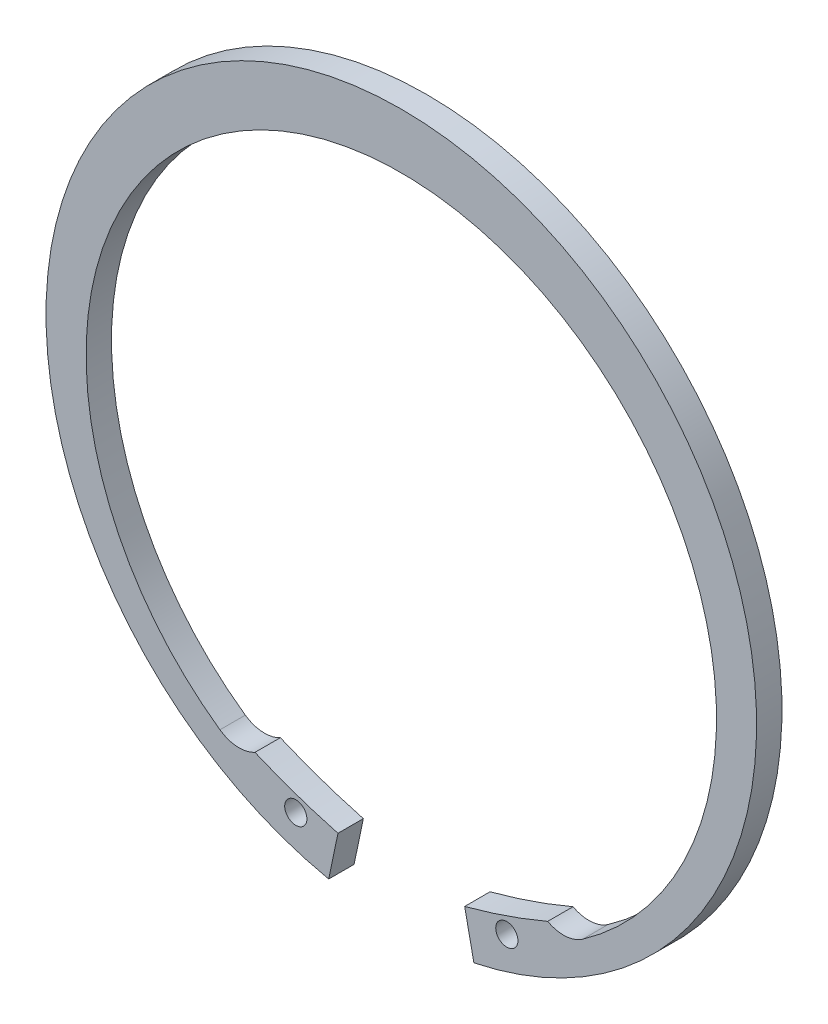
ISO-10303-21;
HEADER;
FILE_DESCRIPTION(('STEP AP214'),'2;1');
FILE_NAME('part.step','',(''),(''),'','','');
FILE_SCHEMA(('AUTOMOTIVE_DESIGN { 1 0 10303 214 1 1 1 1 }'));
ENDSEC;
DATA;
#1=APPLICATION_CONTEXT('core data for automotive mechanical design processes');
#2=APPLICATION_PROTOCOL_DEFINITION('international standard','automotive_design',2000,#1);
#3=PRODUCT_CONTEXT('',#1,'mechanical');
#4=PRODUCT('Part','Part','',(#3));
#5=PRODUCT_RELATED_PRODUCT_CATEGORY('part','',(#4));
#6=PRODUCT_DEFINITION_FORMATION('','',#4);
#7=PRODUCT_DEFINITION_CONTEXT('part definition',#1,'design');
#8=PRODUCT_DEFINITION('design','',#6,#7);
#9=PRODUCT_DEFINITION_SHAPE('','',#8);
#10=(LENGTH_UNIT() NAMED_UNIT(*) SI_UNIT(.MILLI.,.METRE.));
#11=(NAMED_UNIT(*) PLANE_ANGLE_UNIT() SI_UNIT($,.RADIAN.));
#12=(NAMED_UNIT(*) SI_UNIT($,.STERADIAN.) SOLID_ANGLE_UNIT());
#13=UNCERTAINTY_MEASURE_WITH_UNIT(LENGTH_MEASURE(1.E-05),#10,'distance_accuracy_value','');
#14=(GEOMETRIC_REPRESENTATION_CONTEXT(3) GLOBAL_UNCERTAINTY_ASSIGNED_CONTEXT((#13)) GLOBAL_UNIT_ASSIGNED_CONTEXT((#10,
#11,#12)) REPRESENTATION_CONTEXT('',''));
#15=CARTESIAN_POINT('',(0.,0.,0.));
#16=DIRECTION('',(0.,0.,1.));
#17=DIRECTION('',(1.,0.,0.));
#18=AXIS2_PLACEMENT_3D('',#15,#16,#17);
#19=CARTESIAN_POINT('',(0.,0.,-2.));
#20=DIRECTION('',(0.,0.,-1.));
#21=DIRECTION('',(-1.,0.,0.));
#22=AXIS2_PLACEMENT_3D('',#19,#20,#21);
#23=PLANE('',#22);
#24=CARTESIAN_POINT('',(16.6310287485465,-48.3334292007108,-2.));
#25=DIRECTION('',(0.,0.,1.));
#26=DIRECTION('',(-1.,0.,0.));
#27=AXIS2_PLACEMENT_3D('',#24,#25,#26);
#28=CIRCLE('',#27,1.75);
#29=CARTESIAN_POINT('',(14.8810287485465,-48.3334292007108,-2.));
#30=VERTEX_POINT('',#29);
#31=EDGE_CURVE('E137',#30,#30,#28,.T.);
#32=ORIENTED_EDGE('',*,*,#31,.T.);
#33=EDGE_LOOP('',(#32));
#34=FACE_BOUND('',#33,.T.);
#35=CARTESIAN_POINT('',(-16.6310287485465,-48.3334292007108,-2.));
#36=DIRECTION('',(0.,0.,1.));
#37=DIRECTION('',(1.,0.,0.));
#38=AXIS2_PLACEMENT_3D('',#35,#36,#37);
#39=CIRCLE('',#38,1.75);
#40=CARTESIAN_POINT('',(-14.8810287485465,-48.3334292007108,-2.));
#41=VERTEX_POINT('',#40);
#42=EDGE_CURVE('E146',#41,#41,#39,.T.);
#43=ORIENTED_EDGE('',*,*,#42,.T.);
#44=EDGE_LOOP('',(#43));
#45=FACE_BOUND('',#44,.T.);
#46=DIRECTION('',(0.204301075268817,-0.978908101225036,0.));
#47=VECTOR('',#46,1.);
#48=CARTESIAN_POINT('',(11.4408602150538,-54.818853668602,-2.));
#49=LINE('',#48,#47);
#50=CARTESIAN_POINT('',(9.98521505376344,-47.8441334473736,-2.));
#51=VERTEX_POINT('',#50);
#52=CARTESIAN_POINT('',(11.4408602150538,-54.818853668602,-2.));
#53=VERTEX_POINT('',#52);
#54=EDGE_CURVE('E167',#51,#53,#49,.T.);
#55=ORIENTED_EDGE('',*,*,#54,.F.);
#56=CARTESIAN_POINT('',(-14.5794432072077,44.8096974984805,-2.));
#57=DIRECTION('',(0.,0.,-1.));
#58=DIRECTION('',(-1.,0.,0.));
#59=AXIS2_PLACEMENT_3D('',#56,#57,#58);
#60=CIRCLE('',#59,95.8548633321294);
#61=CARTESIAN_POINT('',(23.0692169426214,-43.3420648965158,-2.));
#62=VERTEX_POINT('',#61);
#63=EDGE_CURVE('E119',#62,#51,#60,.T.);
#64=ORIENTED_EDGE('',*,*,#63,.F.);
#65=CARTESIAN_POINT('',(25.5659976036568,-38.7237766496997,-2.));
#66=DIRECTION('',(0.,0.,-1.));
#67=DIRECTION('',(-1.,0.,0.));
#68=AXIS2_PLACEMENT_3D('',#65,#66,#67);
#69=CIRCLE('',#68,5.25);
#70=CARTESIAN_POINT('',(28.586767000031,-43.017662099258,-2.));
#71=VERTEX_POINT('',#70);
#72=EDGE_CURVE('E123',#71,#62,#69,.T.);
#73=ORIENTED_EDGE('',*,*,#72,.F.);
#74=CARTESIAN_POINT('',(0.,-2.38288109986152,-2.));
#75=DIRECTION('',(0.,0.,-1.));
#76=DIRECTION('',(-1.,0.,0.));
#77=AXIS2_PLACEMENT_3D('',#74,#75,#76);
#78=CIRCLE('',#77,49.6828810998615);
#79=CARTESIAN_POINT('',(-28.586767000031,-43.017662099258,-2.));
#80=VERTEX_POINT('',#79);
#81=EDGE_CURVE('E161',#80,#71,#78,.T.);
#82=ORIENTED_EDGE('',*,*,#81,.F.);
#83=CARTESIAN_POINT('',(-25.5659976036567,-38.7237766496997,-2.));
#84=DIRECTION('',(0.,0.,-1.));
#85=DIRECTION('',(1.,0.,0.));
#86=AXIS2_PLACEMENT_3D('',#83,#84,#85);
#87=CIRCLE('',#86,5.25);
#88=CARTESIAN_POINT('',(-23.0692169426214,-43.3420648965158,-2.));
#89=VERTEX_POINT('',#88);
#90=EDGE_CURVE('E157',#89,#80,#87,.T.);
#91=ORIENTED_EDGE('',*,*,#90,.F.);
#92=CARTESIAN_POINT('',(14.5794432072077,44.8096974984805,-2.));
#93=DIRECTION('',(0.,0.,1.));
#94=DIRECTION('',(1.,0.,0.));
#95=AXIS2_PLACEMENT_3D('',#92,#93,#94);
#96=CIRCLE('',#95,95.8548633321294);
#97=CARTESIAN_POINT('',(-9.98521505376344,-47.8441334473736,-2.));
#98=VERTEX_POINT('',#97);
#99=EDGE_CURVE('E222',#89,#98,#96,.T.);
#100=ORIENTED_EDGE('',*,*,#99,.T.);
#101=DIRECTION('',(0.204301075268817,0.978908101225036,0.));
#102=VECTOR('',#101,1.);
#103=CARTESIAN_POINT('',(-11.4408602150538,-54.818853668602,-2.));
#104=LINE('',#103,#102);
#105=CARTESIAN_POINT('',(-11.4408602150538,-54.818853668602,-2.));
#106=VERTEX_POINT('',#105);
#107=EDGE_CURVE('E153',#106,#98,#104,.T.);
#108=ORIENTED_EDGE('',*,*,#107,.F.);
#109=CARTESIAN_POINT('',(0.,0.,-2.));
#110=DIRECTION('',(0.,0.,1.));
#111=DIRECTION('',(-1.,0.,0.));
#112=AXIS2_PLACEMENT_3D('',#109,#110,#111);
#113=CIRCLE('',#112,56.);
#114=EDGE_CURVE('E150',#53,#106,#113,.T.);
#115=ORIENTED_EDGE('',*,*,#114,.F.);
#116=EDGE_LOOP('',(#55,#64,#73,#82,#91,#100,#108,#115));
#117=FACE_BOUND('',#116,.T.);
#118=ADVANCED_FACE('F41',(#34,#45,#117),#23,.T.);
#119=CARTESIAN_POINT('',(0.,0.,2.));
#120=DIRECTION('',(0.,0.,-1.));
#121=DIRECTION('',(-1.,0.,0.));
#122=AXIS2_PLACEMENT_3D('',#119,#120,#121);
#123=PLANE('',#122);
#124=CARTESIAN_POINT('',(16.6310287485465,-48.3334292007108,2.));
#125=DIRECTION('',(0.,0.,1.));
#126=DIRECTION('',(-1.,0.,0.));
#127=AXIS2_PLACEMENT_3D('',#124,#125,#126);
#128=CIRCLE('',#127,1.75);
#129=CARTESIAN_POINT('',(14.8810287485465,-48.3334292007108,2.));
#130=VERTEX_POINT('',#129);
#131=EDGE_CURVE('E203',#130,#130,#128,.T.);
#132=ORIENTED_EDGE('',*,*,#131,.F.);
#133=EDGE_LOOP('',(#132));
#134=FACE_BOUND('',#133,.T.);
#135=CARTESIAN_POINT('',(-16.6310287485465,-48.3334292007108,2.));
#136=DIRECTION('',(0.,0.,1.));
#137=DIRECTION('',(1.,0.,0.));
#138=AXIS2_PLACEMENT_3D('',#135,#136,#137);
#139=CIRCLE('',#138,1.75);
#140=CARTESIAN_POINT('',(-14.8810287485465,-48.3334292007108,2.));
#141=VERTEX_POINT('',#140);
#142=EDGE_CURVE('E198',#141,#141,#139,.T.);
#143=ORIENTED_EDGE('',*,*,#142,.F.);
#144=EDGE_LOOP('',(#143));
#145=FACE_BOUND('',#144,.T.);
#146=CARTESIAN_POINT('',(-14.5794432072077,44.8096974984805,2.));
#147=DIRECTION('',(0.,0.,-1.));
#148=DIRECTION('',(-1.,0.,0.));
#149=AXIS2_PLACEMENT_3D('',#146,#147,#148);
#150=CIRCLE('',#149,95.8548633321294);
#151=CARTESIAN_POINT('',(23.0692169426214,-43.3420648965158,2.));
#152=VERTEX_POINT('',#151);
#153=CARTESIAN_POINT('',(9.98521505376346,-47.8441334473736,2.));
#154=VERTEX_POINT('',#153);
#155=EDGE_CURVE('E108',#152,#154,#150,.T.);
#156=ORIENTED_EDGE('',*,*,#155,.T.);
#157=DIRECTION('',(0.204301075268817,-0.978908101225036,0.));
#158=VECTOR('',#157,1.);
#159=CARTESIAN_POINT('',(11.4408602150538,-54.818853668602,2.));
#160=LINE('',#159,#158);
#161=CARTESIAN_POINT('',(11.4408602150538,-54.818853668602,2.));
#162=VERTEX_POINT('',#161);
#163=EDGE_CURVE('E132',#154,#162,#160,.T.);
#164=ORIENTED_EDGE('',*,*,#163,.T.);
#165=CARTESIAN_POINT('',(0.,0.,2.));
#166=DIRECTION('',(0.,0.,1.));
#167=DIRECTION('',(-1.,0.,0.));
#168=AXIS2_PLACEMENT_3D('',#165,#166,#167);
#169=CIRCLE('',#168,56.);
#170=CARTESIAN_POINT('',(-11.4408602150538,-54.818853668602,2.));
#171=VERTEX_POINT('',#170);
#172=EDGE_CURVE('E190',#162,#171,#169,.T.);
#173=ORIENTED_EDGE('',*,*,#172,.T.);
#174=DIRECTION('',(0.204301075268817,0.978908101225036,0.));
#175=VECTOR('',#174,1.);
#176=CARTESIAN_POINT('',(-11.4408602150538,-54.818853668602,2.));
#177=LINE('',#176,#175);
#178=CARTESIAN_POINT('',(-9.98521505376344,-47.8441334473736,2.));
#179=VERTEX_POINT('',#178);
#180=EDGE_CURVE('E192',#171,#179,#177,.T.);
#181=ORIENTED_EDGE('',*,*,#180,.T.);
#182=CARTESIAN_POINT('',(14.5794432072077,44.8096974984805,2.));
#183=DIRECTION('',(0.,0.,1.));
#184=DIRECTION('',(1.,0.,0.));
#185=AXIS2_PLACEMENT_3D('',#182,#183,#184);
#186=CIRCLE('',#185,95.8548633321294);
#187=CARTESIAN_POINT('',(-23.0692169426214,-43.3420648965158,2.));
#188=VERTEX_POINT('',#187);
#189=EDGE_CURVE('E209',#188,#179,#186,.T.);
#190=ORIENTED_EDGE('',*,*,#189,.F.);
#191=CARTESIAN_POINT('',(-25.5659976036567,-38.7237766496997,2.));
#192=DIRECTION('',(0.,0.,-1.));
#193=DIRECTION('',(1.,0.,0.));
#194=AXIS2_PLACEMENT_3D('',#191,#192,#193);
#195=CIRCLE('',#194,5.25);
#196=CARTESIAN_POINT('',(-28.586767000031,-43.017662099258,2.));
#197=VERTEX_POINT('',#196);
#198=EDGE_CURVE('E139',#188,#197,#195,.T.);
#199=ORIENTED_EDGE('',*,*,#198,.T.);
#200=CARTESIAN_POINT('',(0.,-2.38288109986152,2.));
#201=DIRECTION('',(0.,0.,-1.));
#202=DIRECTION('',(-1.,0.,0.));
#203=AXIS2_PLACEMENT_3D('',#200,#201,#202);
#204=CIRCLE('',#203,49.6828810998615);
#205=CARTESIAN_POINT('',(28.586767000031,-43.017662099258,2.));
#206=VERTEX_POINT('',#205);
#207=EDGE_CURVE('E130',#197,#206,#204,.T.);
#208=ORIENTED_EDGE('',*,*,#207,.T.);
#209=CARTESIAN_POINT('',(25.5659976036568,-38.7237766496997,2.));
#210=DIRECTION('',(0.,0.,-1.));
#211=DIRECTION('',(-1.,0.,0.));
#212=AXIS2_PLACEMENT_3D('',#209,#210,#211);
#213=CIRCLE('',#212,5.25);
#214=EDGE_CURVE('E122',#206,#152,#213,.T.);
#215=ORIENTED_EDGE('',*,*,#214,.T.);
#216=EDGE_LOOP('',(#156,#164,#173,#181,#190,#199,#208,#215));
#217=FACE_BOUND('',#216,.T.);
#218=ADVANCED_FACE('F127',(#134,#145,#217),#123,.F.);
#219=CARTESIAN_POINT('',(0.,0.,-2.));
#220=DIRECTION('',(0.,0.,1.));
#221=DIRECTION('',(1.,0.,0.));
#222=AXIS2_PLACEMENT_3D('',#219,#220,#221);
#223=CYLINDRICAL_SURFACE('',#222,56.);
#224=DIRECTION('',(0.,0.,1.));
#225=VECTOR('',#224,1.);
#226=CARTESIAN_POINT('',(-11.4408602150538,-54.818853668602,-2.));
#227=LINE('',#226,#225);
#228=EDGE_CURVE('E45',#106,#171,#227,.T.);
#229=ORIENTED_EDGE('',*,*,#228,.T.);
#230=ORIENTED_EDGE('',*,*,#172,.F.);
#231=DIRECTION('',(0.,0.,1.));
#232=VECTOR('',#231,1.);
#233=CARTESIAN_POINT('',(11.4408602150538,-54.818853668602,-2.));
#234=LINE('',#233,#232);
#235=EDGE_CURVE('E11',#53,#162,#234,.T.);
#236=ORIENTED_EDGE('',*,*,#235,.F.);
#237=ORIENTED_EDGE('',*,*,#114,.T.);
#238=EDGE_LOOP('',(#229,#230,#236,#237));
#239=FACE_BOUND('',#238,.T.);
#240=ADVANCED_FACE('F43',(#239),#223,.T.);
#241=CARTESIAN_POINT('',(11.4408602150538,-54.818853668602,-2.));
#242=DIRECTION('',(-0.978908101225036,-0.204301075268817,0.));
#243=DIRECTION('',(0.204301075268817,-0.978908101225036,0.));
#244=AXIS2_PLACEMENT_3D('',#241,#242,#243);
#245=PLANE('',#244);
#246=ORIENTED_EDGE('',*,*,#235,.T.);
#247=ORIENTED_EDGE('',*,*,#163,.F.);
#248=DIRECTION('',(0.,0.,1.));
#249=VECTOR('',#248,1.);
#250=CARTESIAN_POINT('',(9.98521505376346,-47.8441334473736,-2.));
#251=LINE('',#250,#249);
#252=EDGE_CURVE('E51',#51,#154,#251,.T.);
#253=ORIENTED_EDGE('',*,*,#252,.F.);
#254=ORIENTED_EDGE('',*,*,#54,.T.);
#255=EDGE_LOOP('',(#246,#247,#253,#254));
#256=FACE_BOUND('',#255,.T.);
#257=ADVANCED_FACE('F234',(#256),#245,.T.);
#258=CARTESIAN_POINT('',(25.5659976036568,-38.7237766496997,-2.));
#259=DIRECTION('',(0.,0.,1.));
#260=DIRECTION('',(1.,0.,0.));
#261=AXIS2_PLACEMENT_3D('',#258,#259,#260);
#262=CYLINDRICAL_SURFACE('',#261,5.25);
#263=DIRECTION('',(0.,0.,1.));
#264=VECTOR('',#263,1.);
#265=CARTESIAN_POINT('',(23.0692169426214,-43.3420648965158,-2.));
#266=LINE('',#265,#264);
#267=EDGE_CURVE('E111',#62,#152,#266,.T.);
#268=ORIENTED_EDGE('',*,*,#267,.T.);
#269=ORIENTED_EDGE('',*,*,#214,.F.);
#270=DIRECTION('',(0.,0.,1.));
#271=VECTOR('',#270,1.);
#272=CARTESIAN_POINT('',(28.586767000031,-43.017662099258,-2.));
#273=LINE('',#272,#271);
#274=EDGE_CURVE('E65',#71,#206,#273,.T.);
#275=ORIENTED_EDGE('',*,*,#274,.F.);
#276=ORIENTED_EDGE('',*,*,#72,.T.);
#277=EDGE_LOOP('',(#268,#269,#275,#276));
#278=FACE_BOUND('',#277,.T.);
#279=ADVANCED_FACE('F121',(#278),#262,.F.);
#280=CARTESIAN_POINT('',(0.,-2.38288109986152,-2.));
#281=DIRECTION('',(0.,0.,1.));
#282=DIRECTION('',(1.,0.,0.));
#283=AXIS2_PLACEMENT_3D('',#280,#281,#282);
#284=CYLINDRICAL_SURFACE('',#283,49.6828810998615);
#285=ORIENTED_EDGE('',*,*,#274,.T.);
#286=ORIENTED_EDGE('',*,*,#207,.F.);
#287=DIRECTION('',(0.,0.,1.));
#288=VECTOR('',#287,1.);
#289=CARTESIAN_POINT('',(-28.586767000031,-43.017662099258,-2.));
#290=LINE('',#289,#288);
#291=EDGE_CURVE('E175',#80,#197,#290,.T.);
#292=ORIENTED_EDGE('',*,*,#291,.F.);
#293=ORIENTED_EDGE('',*,*,#81,.T.);
#294=EDGE_LOOP('',(#285,#286,#292,#293));
#295=FACE_BOUND('',#294,.T.);
#296=ADVANCED_FACE('F213',(#295),#284,.F.);
#297=CARTESIAN_POINT('',(-25.5659976036567,-38.7237766496997,-2.));
#298=DIRECTION('',(0.,0.,1.));
#299=DIRECTION('',(1.,0.,0.));
#300=AXIS2_PLACEMENT_3D('',#297,#298,#299);
#301=CYLINDRICAL_SURFACE('',#300,5.25);
#302=ORIENTED_EDGE('',*,*,#291,.T.);
#303=ORIENTED_EDGE('',*,*,#198,.F.);
#304=DIRECTION('',(0.,0.,1.));
#305=VECTOR('',#304,1.);
#306=CARTESIAN_POINT('',(-23.0692169426214,-43.3420648965158,-2.));
#307=LINE('',#306,#305);
#308=EDGE_CURVE('E178',#89,#188,#307,.T.);
#309=ORIENTED_EDGE('',*,*,#308,.F.);
#310=ORIENTED_EDGE('',*,*,#90,.T.);
#311=EDGE_LOOP('',(#302,#303,#309,#310));
#312=FACE_BOUND('',#311,.T.);
#313=ADVANCED_FACE('F219',(#312),#301,.F.);
#314=CARTESIAN_POINT('',(-11.4408602150538,-54.818853668602,-2.));
#315=DIRECTION('',(0.978908101225036,-0.204301075268817,0.));
#316=DIRECTION('',(0.204301075268817,0.978908101225036,0.));
#317=AXIS2_PLACEMENT_3D('',#314,#315,#316);
#318=PLANE('',#317);
#319=DIRECTION('',(0.,0.,1.));
#320=VECTOR('',#319,1.);
#321=CARTESIAN_POINT('',(-9.98521505376344,-47.8441334473736,-2.));
#322=LINE('',#321,#320);
#323=EDGE_CURVE('E180',#98,#179,#322,.T.);
#324=ORIENTED_EDGE('',*,*,#323,.T.);
#325=ORIENTED_EDGE('',*,*,#180,.F.);
#326=ORIENTED_EDGE('',*,*,#228,.F.);
#327=ORIENTED_EDGE('',*,*,#107,.T.);
#328=EDGE_LOOP('',(#324,#325,#326,#327));
#329=FACE_BOUND('',#328,.T.);
#330=ADVANCED_FACE('F193',(#329),#318,.T.);
#331=CARTESIAN_POINT('',(-16.6310287485465,-48.3334292007108,-2.));
#332=DIRECTION('',(0.,0.,1.));
#333=DIRECTION('',(1.,0.,0.));
#334=AXIS2_PLACEMENT_3D('',#331,#332,#333);
#335=CYLINDRICAL_SURFACE('',#334,1.75);
#336=ORIENTED_EDGE('',*,*,#42,.F.);
#337=EDGE_LOOP('',(#336));
#338=FACE_BOUND('',#337,.T.);
#339=ORIENTED_EDGE('',*,*,#142,.T.);
#340=EDGE_LOOP('',(#339));
#341=FACE_BOUND('',#340,.T.);
#342=ADVANCED_FACE('F252',(#338,#341),#335,.F.);
#343=CARTESIAN_POINT('',(16.6310287485465,-48.3334292007108,-2.));
#344=DIRECTION('',(0.,0.,1.));
#345=DIRECTION('',(1.,0.,0.));
#346=AXIS2_PLACEMENT_3D('',#343,#344,#345);
#347=CYLINDRICAL_SURFACE('',#346,1.75);
#348=ORIENTED_EDGE('',*,*,#31,.F.);
#349=EDGE_LOOP('',(#348));
#350=FACE_BOUND('',#349,.T.);
#351=ORIENTED_EDGE('',*,*,#131,.T.);
#352=EDGE_LOOP('',(#351));
#353=FACE_BOUND('',#352,.T.);
#354=ADVANCED_FACE('F255',(#350,#353),#347,.F.);
#355=CARTESIAN_POINT('',(14.5794432072077,44.8096974984805,-2.));
#356=DIRECTION('',(0.,0.,1.));
#357=DIRECTION('',(1.,0.,0.));
#358=AXIS2_PLACEMENT_3D('',#355,#356,#357);
#359=CYLINDRICAL_SURFACE('',#358,95.8548633321294);
#360=ORIENTED_EDGE('',*,*,#323,.F.);
#361=ORIENTED_EDGE('',*,*,#99,.F.);
#362=ORIENTED_EDGE('',*,*,#308,.T.);
#363=ORIENTED_EDGE('',*,*,#189,.T.);
#364=EDGE_LOOP('',(#360,#361,#362,#363));
#365=FACE_BOUND('',#364,.T.);
#366=ADVANCED_FACE('F221',(#365),#359,.F.);
#367=CARTESIAN_POINT('',(-14.5794432072077,44.8096974984805,-2.));
#368=DIRECTION('',(0.,0.,1.));
#369=DIRECTION('',(1.,0.,0.));
#370=AXIS2_PLACEMENT_3D('',#367,#368,#369);
#371=CYLINDRICAL_SURFACE('',#370,95.8548633321294);
#372=ORIENTED_EDGE('',*,*,#267,.F.);
#373=ORIENTED_EDGE('',*,*,#63,.T.);
#374=ORIENTED_EDGE('',*,*,#252,.T.);
#375=ORIENTED_EDGE('',*,*,#155,.F.);
#376=EDGE_LOOP('',(#372,#373,#374,#375));
#377=FACE_BOUND('',#376,.T.);
#378=ADVANCED_FACE('F110',(#377),#371,.F.);
#379=CLOSED_SHELL('',(#118,#218,#240,#257,#279,#296,#313,#330,#342,#354,#366,#378));
#380=MANIFOLD_SOLID_BREP('B2',#379);
#381=ADVANCED_BREP_SHAPE_REPRESENTATION('',(#18,#380),#14);
#382=SHAPE_DEFINITION_REPRESENTATION(#9,#381);
ENDSEC;
END-ISO-10303-21;
